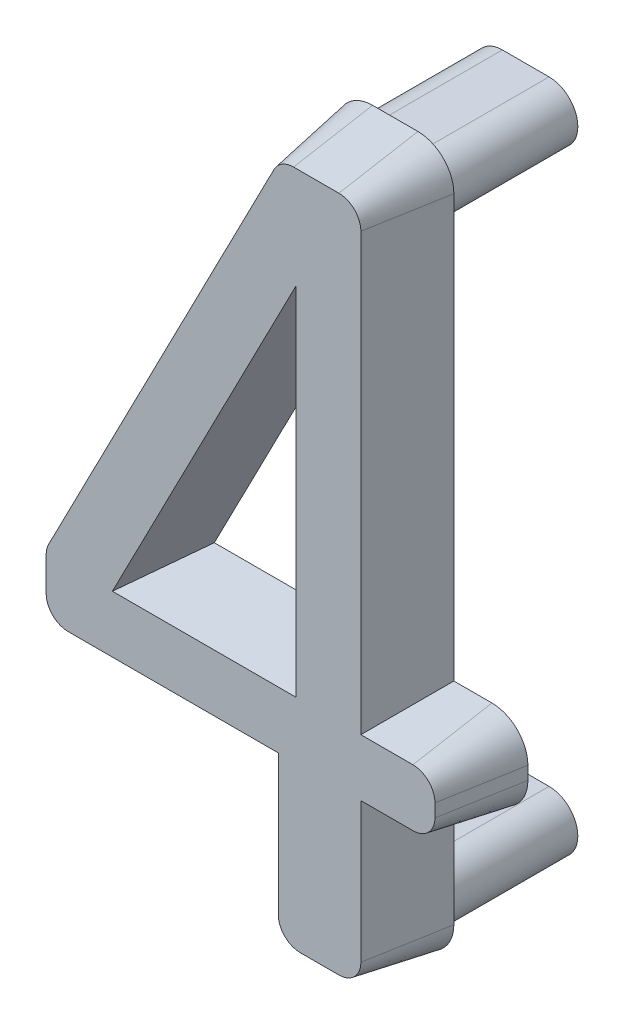
ISO-10303-21;
HEADER;
FILE_DESCRIPTION(('STEP AP214'),'2;1');
FILE_NAME('part.step','',(''),(''),'','','');
FILE_SCHEMA(('AUTOMOTIVE_DESIGN { 1 0 10303 214 1 1 1 1 }'));
ENDSEC;
DATA;
#1=APPLICATION_CONTEXT('core data for automotive mechanical design processes');
#2=APPLICATION_PROTOCOL_DEFINITION('international standard','automotive_design',2000,#1);
#3=PRODUCT_CONTEXT('',#1,'mechanical');
#4=PRODUCT('Part','Part','',(#3));
#5=PRODUCT_RELATED_PRODUCT_CATEGORY('part','',(#4));
#6=PRODUCT_DEFINITION_FORMATION('','',#4);
#7=PRODUCT_DEFINITION_CONTEXT('part definition',#1,'design');
#8=PRODUCT_DEFINITION('design','',#6,#7);
#9=PRODUCT_DEFINITION_SHAPE('','',#8);
#10=(LENGTH_UNIT() NAMED_UNIT(*) SI_UNIT(.MILLI.,.METRE.));
#11=(NAMED_UNIT(*) PLANE_ANGLE_UNIT() SI_UNIT($,.RADIAN.));
#12=(NAMED_UNIT(*) SI_UNIT($,.STERADIAN.) SOLID_ANGLE_UNIT());
#13=UNCERTAINTY_MEASURE_WITH_UNIT(LENGTH_MEASURE(1.E-05),#10,'distance_accuracy_value','');
#14=(GEOMETRIC_REPRESENTATION_CONTEXT(3) GLOBAL_UNCERTAINTY_ASSIGNED_CONTEXT((#13)) GLOBAL_UNIT_ASSIGNED_CONTEXT((#10,
#11,#12)) REPRESENTATION_CONTEXT('',''));
#15=CARTESIAN_POINT('',(0.,0.,0.));
#16=DIRECTION('',(0.,0.,1.));
#17=DIRECTION('',(1.,0.,0.));
#18=AXIS2_PLACEMENT_3D('',#15,#16,#17);
#19=CARTESIAN_POINT('',(60.3334080717489,1.17017937219731,2.2));
#20=DIRECTION('',(0.,0.,1.));
#21=DIRECTION('',(1.,0.,0.));
#22=AXIS2_PLACEMENT_3D('',#19,#20,#21);
#23=PLANE('',#22);
#24=CARTESIAN_POINT('',(60.3334080717489,1.17017937219731,2.2));
#25=DIRECTION('',(0.,0.,1.));
#26=DIRECTION('',(1.,0.,0.));
#27=AXIS2_PLACEMENT_3D('',#24,#25,#26);
#28=CIRCLE('',#27,0.612080642441377);
#29=CARTESIAN_POINT('',(59.7213274293075,1.17017937219731,2.2));
#30=VERTEX_POINT('',#29);
#31=CARTESIAN_POINT('',(60.3334080717489,0.558098729755932,2.2));
#32=VERTEX_POINT('',#31);
#33=EDGE_CURVE('E352',#30,#32,#28,.T.);
#34=ORIENTED_EDGE('',*,*,#33,.T.);
#35=DIRECTION('',(-1.,0.,0.));
#36=VECTOR('',#35,1.);
#37=CARTESIAN_POINT('',(61.407735426009,0.558098729755932,2.2));
#38=LINE('',#37,#36);
#39=CARTESIAN_POINT('',(61.407735426009,0.558098729755932,2.2));
#40=VERTEX_POINT('',#39);
#41=EDGE_CURVE('E410',#32,#40,#38,.F.);
#42=ORIENTED_EDGE('',*,*,#41,.T.);
#43=CARTESIAN_POINT('',(61.407735426009,1.17017937219731,2.2));
#44=DIRECTION('',(0.,0.,1.));
#45=DIRECTION('',(1.,0.,0.));
#46=AXIS2_PLACEMENT_3D('',#43,#44,#45);
#47=CIRCLE('',#46,0.612080642441377);
#48=CARTESIAN_POINT('',(62.0198160684504,1.17017937219732,2.2));
#49=VERTEX_POINT('',#48);
#50=EDGE_CURVE('E412',#40,#49,#47,.T.);
#51=ORIENTED_EDGE('',*,*,#50,.T.);
#52=DIRECTION('',(0.,-1.,0.));
#53=VECTOR('',#52,1.);
#54=CARTESIAN_POINT('',(62.0198160684504,4.67993273542601,2.2));
#55=LINE('',#54,#53);
#56=CARTESIAN_POINT('',(62.0198160684504,5.06785209298463,2.2));
#57=VERTEX_POINT('',#56);
#58=EDGE_CURVE('E414',#49,#57,#55,.F.);
#59=ORIENTED_EDGE('',*,*,#58,.T.);
#60=DIRECTION('',(-1.,0.,0.));
#61=VECTOR('',#60,1.);
#62=CARTESIAN_POINT('',(63.4683856502242,5.06785209298463,2.2));
#63=LINE('',#62,#61);
#64=CARTESIAN_POINT('',(63.4683856502242,5.06785209298463,2.2));
#65=VERTEX_POINT('',#64);
#66=EDGE_CURVE('E416',#57,#65,#63,.F.);
#67=ORIENTED_EDGE('',*,*,#66,.T.);
#68=CARTESIAN_POINT('',(63.4683856502242,5.67993273542601,2.2));
#69=DIRECTION('',(0.,0.,1.));
#70=DIRECTION('',(1.,0.,0.));
#71=AXIS2_PLACEMENT_3D('',#68,#69,#70);
#72=CIRCLE('',#71,0.612080642441377);
#73=CARTESIAN_POINT('',(64.0804662926656,5.67993273542602,2.2));
#74=VERTEX_POINT('',#73);
#75=EDGE_CURVE('E418',#65,#74,#72,.T.);
#76=ORIENTED_EDGE('',*,*,#75,.T.);
#77=DIRECTION('',(0.,-1.,0.));
#78=VECTOR('',#77,1.);
#79=CARTESIAN_POINT('',(64.0804662926656,6.0439461883408,2.2));
#80=LINE('',#79,#78);
#81=CARTESIAN_POINT('',(64.0804662926656,6.0439461883408,2.2));
#82=VERTEX_POINT('',#81);
#83=EDGE_CURVE('E420',#74,#82,#80,.F.);
#84=ORIENTED_EDGE('',*,*,#83,.T.);
#85=CARTESIAN_POINT('',(63.4683856502242,6.04394618834081,2.2));
#86=DIRECTION('',(0.,0.,1.));
#87=DIRECTION('',(1.,0.,0.));
#88=AXIS2_PLACEMENT_3D('',#85,#86,#87);
#89=CIRCLE('',#88,0.612080642441377);
#90=CARTESIAN_POINT('',(63.4683856502242,6.65602683078219,2.2));
#91=VERTEX_POINT('',#90);
#92=EDGE_CURVE('E422',#82,#91,#89,.T.);
#93=ORIENTED_EDGE('',*,*,#92,.T.);
#94=DIRECTION('',(1.,0.,0.));
#95=VECTOR('',#94,1.);
#96=CARTESIAN_POINT('',(62.407735426009,6.65602683078219,2.2));
#97=LINE('',#96,#95);
#98=CARTESIAN_POINT('',(62.0198160684504,6.65602683078219,2.2));
#99=VERTEX_POINT('',#98);
#100=EDGE_CURVE('E424',#91,#99,#97,.F.);
#101=ORIENTED_EDGE('',*,*,#100,.T.);
#102=DIRECTION('',(0.,-1.,0.));
#103=VECTOR('',#102,1.);
#104=CARTESIAN_POINT('',(62.0198160684504,18.7889013452915,2.2));
#105=LINE('',#104,#103);
#106=CARTESIAN_POINT('',(62.0198160684504,18.7889013452915,2.2));
#107=VERTEX_POINT('',#106);
#108=EDGE_CURVE('E426',#99,#107,#105,.F.);
#109=ORIENTED_EDGE('',*,*,#108,.T.);
#110=CARTESIAN_POINT('',(61.407735426009,18.7889013452915,2.2));
#111=DIRECTION('',(0.,0.,1.));
#112=DIRECTION('',(1.,0.,0.));
#113=AXIS2_PLACEMENT_3D('',#110,#111,#112);
#114=CIRCLE('',#113,0.612080642441378);
#115=CARTESIAN_POINT('',(61.407735426009,19.4009819877329,2.2));
#116=VERTEX_POINT('',#115);
#117=EDGE_CURVE('E428',#107,#116,#114,.T.);
#118=ORIENTED_EDGE('',*,*,#117,.T.);
#119=DIRECTION('',(1.,0.,0.));
#120=VECTOR('',#119,1.);
#121=CARTESIAN_POINT('',(60.1464589751106,19.4009819877329,2.2));
#122=LINE('',#121,#120);
#123=CARTESIAN_POINT('',(60.1464589751106,19.4009819877329,2.2));
#124=VERTEX_POINT('',#123);
#125=EDGE_CURVE('E430',#116,#124,#122,.F.);
#126=ORIENTED_EDGE('',*,*,#125,.T.);
#127=CARTESIAN_POINT('',(60.1464589751106,18.7889013452915,2.2));
#128=DIRECTION('',(0.,0.,1.));
#129=DIRECTION('',(1.,0.,0.));
#130=AXIS2_PLACEMENT_3D('',#127,#128,#129);
#131=CIRCLE('',#130,0.612080642441377);
#132=CARTESIAN_POINT('',(59.6024021071815,19.0693382139636,2.2));
#133=VERTEX_POINT('',#132);
#134=EDGE_CURVE('E432',#124,#133,#131,.T.);
#135=ORIENTED_EDGE('',*,*,#134,.T.);
#136=DIRECTION('',(0.458169805131459,0.888864685801951,0.));
#137=VECTOR('',#136,1.);
#138=CARTESIAN_POINT('',(53.329934163461,6.9005414369734,2.2));
#139=LINE('',#138,#137);
#140=CARTESIAN_POINT('',(53.329934163461,6.90054143697339,2.2));
#141=VERTEX_POINT('',#140);
#142=EDGE_CURVE('E434',#133,#141,#139,.F.);
#143=ORIENTED_EDGE('',*,*,#142,.T.);
#144=CARTESIAN_POINT('',(53.8739910313901,6.62010456830129,2.2));
#145=DIRECTION('',(0.,0.,1.));
#146=DIRECTION('',(1.,0.,0.));
#147=AXIS2_PLACEMENT_3D('',#144,#145,#146);
#148=CIRCLE('',#147,0.612080642441379);
#149=CARTESIAN_POINT('',(53.2619103889488,6.62010456830129,2.2));
#150=VERTEX_POINT('',#149);
#151=EDGE_CURVE('E436',#141,#150,#148,.T.);
#152=ORIENTED_EDGE('',*,*,#151,.T.);
#153=DIRECTION('',(0.,1.,0.));
#154=VECTOR('',#153,1.);
#155=CARTESIAN_POINT('',(53.2619103889488,5.67993273542602,2.2));
#156=LINE('',#155,#154);
#157=CARTESIAN_POINT('',(53.2619103889488,5.67993273542601,2.2));
#158=VERTEX_POINT('',#157);
#159=EDGE_CURVE('E438',#150,#158,#156,.F.);
#160=ORIENTED_EDGE('',*,*,#159,.T.);
#161=CARTESIAN_POINT('',(53.8739910313901,5.67993273542601,2.2));
#162=DIRECTION('',(0.,0.,1.));
#163=DIRECTION('',(1.,0.,0.));
#164=AXIS2_PLACEMENT_3D('',#161,#162,#163);
#165=CIRCLE('',#164,0.612080642441377);
#166=CARTESIAN_POINT('',(53.8739910313901,5.06785209298463,2.2));
#167=VERTEX_POINT('',#166);
#168=EDGE_CURVE('E440',#158,#167,#165,.T.);
#169=ORIENTED_EDGE('',*,*,#168,.T.);
#170=DIRECTION('',(-1.,0.,0.));
#171=VECTOR('',#170,1.);
#172=CARTESIAN_POINT('',(59.3334080717489,5.06785209298463,2.2));
#173=LINE('',#172,#171);
#174=CARTESIAN_POINT('',(59.7213274293075,5.06785209298463,2.2));
#175=VERTEX_POINT('',#174);
#176=EDGE_CURVE('E442',#167,#175,#173,.F.);
#177=ORIENTED_EDGE('',*,*,#176,.T.);
#178=DIRECTION('',(0.,1.,0.));
#179=VECTOR('',#178,1.);
#180=CARTESIAN_POINT('',(59.7213274293075,1.17017937219732,2.2));
#181=LINE('',#180,#179);
#182=EDGE_CURVE('E358',#175,#30,#181,.F.);
#183=ORIENTED_EDGE('',*,*,#182,.T.);
#184=EDGE_LOOP('',(#34,#42,#51,#59,#67,#76,#84,#93,#101,#109,#118,#126,#135,#143,#152,#160,#169,
#177,#183));
#185=FACE_BOUND('',#184,.T.);
#186=DIRECTION('',(0.,1.,0.));
#187=VECTOR('',#186,1.);
#188=CARTESIAN_POINT('',(60.2113791990813,7.04394618834081,2.2));
#189=LINE('',#188,#187);
#190=CARTESIAN_POINT('',(60.2113791990813,6.65602683078219,2.2));
#191=VERTEX_POINT('',#190);
#192=CARTESIAN_POINT('',(60.2113791990813,16.5630239643737,2.2));
#193=VERTEX_POINT('',#192);
#194=EDGE_CURVE('E37',#191,#193,#189,.T.);
#195=ORIENTED_EDGE('',*,*,#194,.F.);
#196=DIRECTION('',(1.,0.,0.));
#197=VECTOR('',#196,1.);
#198=CARTESIAN_POINT('',(55.7411434977579,6.65602683078219,2.2));
#199=LINE('',#198,#197);
#200=CARTESIAN_POINT('',(55.1047673394367,6.65602683078219,2.2));
#201=VERTEX_POINT('',#200);
#202=EDGE_CURVE('E311',#201,#191,#199,.T.);
#203=ORIENTED_EDGE('',*,*,#202,.F.);
#204=DIRECTION('',(-0.458169805131458,-0.888864685801951,0.));
#205=VECTOR('',#204,1.);
#206=CARTESIAN_POINT('',(59.4786520236499,15.1415088333589,2.2));
#207=LINE('',#206,#205);
#208=EDGE_CURVE('E449',#193,#201,#207,.T.);
#209=ORIENTED_EDGE('',*,*,#208,.F.);
#210=EDGE_LOOP('',(#195,#203,#209));
#211=FACE_BOUND('',#210,.T.);
#212=ADVANCED_FACE('F33',(#185,#211),#23,.T.);
#213=CARTESIAN_POINT('',(60.3334080717489,1.17017937219731,0.));
#214=DIRECTION('',(0.,0.,1.));
#215=DIRECTION('',(1.,0.,0.));
#216=AXIS2_PLACEMENT_3D('',#213,#214,#215);
#217=PLANE('',#216);
#218=DIRECTION('',(-1.,0.,0.));
#219=VECTOR('',#218,1.);
#220=CARTESIAN_POINT('',(60.157735426009,2.22954035874512,0.));
#221=LINE('',#220,#219);
#222=CARTESIAN_POINT('',(61.457735426009,2.22954035874512,0.));
#223=VERTEX_POINT('',#222);
#224=CARTESIAN_POINT('',(60.157735426009,2.22954035874512,0.));
#225=VERTEX_POINT('',#224);
#226=EDGE_CURVE('E257',#223,#225,#221,.T.);
#227=ORIENTED_EDGE('',*,*,#226,.T.);
#228=CARTESIAN_POINT('',(60.157735426009,1.42954035874476,0.));
#229=DIRECTION('',(0.,0.,1.));
#230=DIRECTION('',(1.,0.,0.));
#231=AXIS2_PLACEMENT_3D('',#228,#229,#230);
#232=CIRCLE('',#231,0.800000000000365);
#233=CARTESIAN_POINT('',(60.157735426009,0.629540358744395,0.));
#234=VERTEX_POINT('',#233);
#235=EDGE_CURVE('E264',#225,#234,#232,.T.);
#236=ORIENTED_EDGE('',*,*,#235,.T.);
#237=DIRECTION('',(1.,0.,0.));
#238=VECTOR('',#237,1.);
#239=CARTESIAN_POINT('',(60.157735426009,0.629540358744395,0.));
#240=LINE('',#239,#238);
#241=CARTESIAN_POINT('',(61.457735426009,0.629540358744395,0.));
#242=VERTEX_POINT('',#241);
#243=EDGE_CURVE('E237',#234,#242,#240,.T.);
#244=ORIENTED_EDGE('',*,*,#243,.T.);
#245=CARTESIAN_POINT('',(61.457735426009,1.42954035874476,0.));
#246=DIRECTION('',(0.,0.,1.));
#247=DIRECTION('',(1.,0.,0.));
#248=AXIS2_PLACEMENT_3D('',#245,#246,#247);
#249=CIRCLE('',#248,0.800000000000365);
#250=EDGE_CURVE('E50',#242,#223,#249,.T.);
#251=ORIENTED_EDGE('',*,*,#250,.T.);
#252=EDGE_LOOP('',(#227,#236,#244,#251));
#253=FACE_BOUND('',#252,.T.);
#254=DIRECTION('',(-1.,0.,0.));
#255=VECTOR('',#254,1.);
#256=CARTESIAN_POINT('',(60.157735426009,19.3295403587448,0.));
#257=LINE('',#256,#255);
#258=CARTESIAN_POINT('',(61.457735426009,19.3295403587448,0.));
#259=VERTEX_POINT('',#258);
#260=CARTESIAN_POINT('',(60.157735426009,19.3295403587448,0.));
#261=VERTEX_POINT('',#260);
#262=EDGE_CURVE('E277',#259,#261,#257,.T.);
#263=ORIENTED_EDGE('',*,*,#262,.T.);
#264=CARTESIAN_POINT('',(60.157735426009,18.5295403587448,0.));
#265=DIRECTION('',(0.,0.,1.));
#266=DIRECTION('',(1.,0.,0.));
#267=AXIS2_PLACEMENT_3D('',#264,#265,#266);
#268=CIRCLE('',#267,0.800000000000002);
#269=CARTESIAN_POINT('',(60.157735426009,17.7295403587448,0.));
#270=VERTEX_POINT('',#269);
#271=EDGE_CURVE('E269',#261,#270,#268,.T.);
#272=ORIENTED_EDGE('',*,*,#271,.T.);
#273=DIRECTION('',(1.,0.,0.));
#274=VECTOR('',#273,1.);
#275=CARTESIAN_POINT('',(60.157735426009,17.7295403587448,0.));
#276=LINE('',#275,#274);
#277=CARTESIAN_POINT('',(61.457735426009,17.7295403587448,0.));
#278=VERTEX_POINT('',#277);
#279=EDGE_CURVE('E289',#270,#278,#276,.T.);
#280=ORIENTED_EDGE('',*,*,#279,.T.);
#281=CARTESIAN_POINT('',(61.457735426009,18.5295403587448,0.));
#282=DIRECTION('',(0.,0.,1.));
#283=DIRECTION('',(1.,0.,0.));
#284=AXIS2_PLACEMENT_3D('',#281,#282,#283);
#285=CIRCLE('',#284,0.800000000000002);
#286=EDGE_CURVE('E58',#278,#259,#285,.T.);
#287=ORIENTED_EDGE('',*,*,#286,.T.);
#288=EDGE_LOOP('',(#263,#272,#280,#287));
#289=FACE_BOUND('',#288,.T.);
#290=CARTESIAN_POINT('',(60.3334080717489,1.17017937219731,0.));
#291=DIRECTION('',(0.,0.,1.));
#292=DIRECTION('',(1.,0.,0.));
#293=AXIS2_PLACEMENT_3D('',#290,#291,#292);
#294=CIRCLE('',#293,1.);
#295=CARTESIAN_POINT('',(59.3334080717489,1.17017937219732,0.));
#296=VERTEX_POINT('',#295);
#297=CARTESIAN_POINT('',(60.3334080717489,0.170179372197309,0.));
#298=VERTEX_POINT('',#297);
#299=EDGE_CURVE('E312',#296,#298,#294,.T.);
#300=ORIENTED_EDGE('',*,*,#299,.F.);
#301=DIRECTION('',(0.,-1.,0.));
#302=VECTOR('',#301,1.);
#303=CARTESIAN_POINT('',(59.3334080717489,1.17017937219732,0.));
#304=LINE('',#303,#302);
#305=CARTESIAN_POINT('',(59.3334080717489,4.67993273542601,0.));
#306=VERTEX_POINT('',#305);
#307=EDGE_CURVE('E351',#306,#296,#304,.T.);
#308=ORIENTED_EDGE('',*,*,#307,.F.);
#309=DIRECTION('',(1.,0.,0.));
#310=VECTOR('',#309,1.);
#311=CARTESIAN_POINT('',(59.3334080717489,4.67993273542601,0.));
#312=LINE('',#311,#310);
#313=CARTESIAN_POINT('',(53.8739910313901,4.67993273542601,0.));
#314=VERTEX_POINT('',#313);
#315=EDGE_CURVE('E348',#314,#306,#312,.T.);
#316=ORIENTED_EDGE('',*,*,#315,.F.);
#317=CARTESIAN_POINT('',(53.8739910313901,5.67993273542601,0.));
#318=DIRECTION('',(0.,0.,1.));
#319=DIRECTION('',(-1.,0.,0.));
#320=AXIS2_PLACEMENT_3D('',#317,#318,#319);
#321=CIRCLE('',#320,1.);
#322=CARTESIAN_POINT('',(52.8739910313901,5.67993273542601,0.));
#323=VERTEX_POINT('',#322);
#324=EDGE_CURVE('E346',#323,#314,#321,.T.);
#325=ORIENTED_EDGE('',*,*,#324,.F.);
#326=DIRECTION('',(0.,-1.,0.));
#327=VECTOR('',#326,1.);
#328=CARTESIAN_POINT('',(52.8739910313901,5.67993273542602,0.));
#329=LINE('',#328,#327);
#330=CARTESIAN_POINT('',(52.8739910313901,6.62010456830129,0.));
#331=VERTEX_POINT('',#330);
#332=EDGE_CURVE('E344',#331,#323,#329,.T.);
#333=ORIENTED_EDGE('',*,*,#332,.F.);
#334=CARTESIAN_POINT('',(53.8739910313901,6.62010456830129,0.));
#335=DIRECTION('',(0.,0.,1.));
#336=DIRECTION('',(-1.,0.,0.));
#337=AXIS2_PLACEMENT_3D('',#334,#335,#336);
#338=CIRCLE('',#337,1.);
#339=CARTESIAN_POINT('',(52.9851263455882,7.07827437343275,0.));
#340=VERTEX_POINT('',#339);
#341=EDGE_CURVE('E342',#340,#331,#338,.T.);
#342=ORIENTED_EDGE('',*,*,#341,.F.);
#343=DIRECTION('',(-0.458169805131459,-0.888864685801951,0.));
#344=VECTOR('',#343,1.);
#345=CARTESIAN_POINT('',(52.9851263455882,7.07827437343275,0.));
#346=LINE('',#345,#344);
#347=CARTESIAN_POINT('',(59.2575942893087,19.2470711504229,0.));
#348=VERTEX_POINT('',#347);
#349=EDGE_CURVE('E340',#348,#340,#346,.T.);
#350=ORIENTED_EDGE('',*,*,#349,.F.);
#351=CARTESIAN_POINT('',(60.1464589751106,18.7889013452915,0.));
#352=DIRECTION('',(0.,0.,1.));
#353=DIRECTION('',(-1.,0.,0.));
#354=AXIS2_PLACEMENT_3D('',#351,#352,#353);
#355=CIRCLE('',#354,1.);
#356=CARTESIAN_POINT('',(60.1464589751106,19.7889013452915,0.));
#357=VERTEX_POINT('',#356);
#358=EDGE_CURVE('E338',#357,#348,#355,.T.);
#359=ORIENTED_EDGE('',*,*,#358,.F.);
#360=DIRECTION('',(-1.,0.,0.));
#361=VECTOR('',#360,1.);
#362=CARTESIAN_POINT('',(60.1464589751106,19.7889013452915,0.));
#363=LINE('',#362,#361);
#364=CARTESIAN_POINT('',(61.407735426009,19.7889013452915,0.));
#365=VERTEX_POINT('',#364);
#366=EDGE_CURVE('E336',#365,#357,#363,.T.);
#367=ORIENTED_EDGE('',*,*,#366,.F.);
#368=CARTESIAN_POINT('',(61.407735426009,18.7889013452915,0.));
#369=DIRECTION('',(0.,0.,1.));
#370=DIRECTION('',(-1.,0.,0.));
#371=AXIS2_PLACEMENT_3D('',#368,#369,#370);
#372=CIRCLE('',#371,1.);
#373=CARTESIAN_POINT('',(62.407735426009,18.7889013452915,0.));
#374=VERTEX_POINT('',#373);
#375=EDGE_CURVE('E334',#374,#365,#372,.T.);
#376=ORIENTED_EDGE('',*,*,#375,.F.);
#377=DIRECTION('',(0.,1.,0.));
#378=VECTOR('',#377,1.);
#379=CARTESIAN_POINT('',(62.407735426009,18.7889013452915,0.));
#380=LINE('',#379,#378);
#381=CARTESIAN_POINT('',(62.407735426009,7.04394618834081,0.));
#382=VERTEX_POINT('',#381);
#383=EDGE_CURVE('E332',#382,#374,#380,.T.);
#384=ORIENTED_EDGE('',*,*,#383,.F.);
#385=DIRECTION('',(-1.,0.,0.));
#386=VECTOR('',#385,1.);
#387=CARTESIAN_POINT('',(62.407735426009,7.04394618834081,0.));
#388=LINE('',#387,#386);
#389=CARTESIAN_POINT('',(63.4683856502242,7.04394618834081,0.));
#390=VERTEX_POINT('',#389);
#391=EDGE_CURVE('E330',#390,#382,#388,.T.);
#392=ORIENTED_EDGE('',*,*,#391,.F.);
#393=CARTESIAN_POINT('',(63.4683856502242,6.04394618834081,0.));
#394=DIRECTION('',(0.,0.,1.));
#395=DIRECTION('',(-1.,0.,0.));
#396=AXIS2_PLACEMENT_3D('',#393,#394,#395);
#397=CIRCLE('',#396,1.);
#398=CARTESIAN_POINT('',(64.4683856502242,6.0439461883408,0.));
#399=VERTEX_POINT('',#398);
#400=EDGE_CURVE('E328',#399,#390,#397,.T.);
#401=ORIENTED_EDGE('',*,*,#400,.F.);
#402=DIRECTION('',(0.,1.,0.));
#403=VECTOR('',#402,1.);
#404=CARTESIAN_POINT('',(64.4683856502242,6.0439461883408,0.));
#405=LINE('',#404,#403);
#406=CARTESIAN_POINT('',(64.4683856502242,5.67993273542602,0.));
#407=VERTEX_POINT('',#406);
#408=EDGE_CURVE('E326',#407,#399,#405,.T.);
#409=ORIENTED_EDGE('',*,*,#408,.F.);
#410=CARTESIAN_POINT('',(63.4683856502242,5.67993273542601,0.));
#411=DIRECTION('',(0.,0.,1.));
#412=DIRECTION('',(-1.,0.,0.));
#413=AXIS2_PLACEMENT_3D('',#410,#411,#412);
#414=CIRCLE('',#413,1.);
#415=CARTESIAN_POINT('',(63.4683856502242,4.67993273542601,0.));
#416=VERTEX_POINT('',#415);
#417=EDGE_CURVE('E324',#416,#407,#414,.T.);
#418=ORIENTED_EDGE('',*,*,#417,.F.);
#419=DIRECTION('',(1.,0.,0.));
#420=VECTOR('',#419,1.);
#421=CARTESIAN_POINT('',(63.4683856502242,4.67993273542601,0.));
#422=LINE('',#421,#420);
#423=CARTESIAN_POINT('',(62.407735426009,4.67993273542601,0.));
#424=VERTEX_POINT('',#423);
#425=EDGE_CURVE('E322',#424,#416,#422,.T.);
#426=ORIENTED_EDGE('',*,*,#425,.F.);
#427=DIRECTION('',(0.,1.,0.));
#428=VECTOR('',#427,1.);
#429=CARTESIAN_POINT('',(62.407735426009,4.67993273542601,0.));
#430=LINE('',#429,#428);
#431=CARTESIAN_POINT('',(62.407735426009,1.17017937219732,0.));
#432=VERTEX_POINT('',#431);
#433=EDGE_CURVE('E320',#432,#424,#430,.T.);
#434=ORIENTED_EDGE('',*,*,#433,.F.);
#435=CARTESIAN_POINT('',(61.407735426009,1.17017937219731,0.));
#436=DIRECTION('',(0.,0.,1.));
#437=DIRECTION('',(-1.,0.,0.));
#438=AXIS2_PLACEMENT_3D('',#435,#436,#437);
#439=CIRCLE('',#438,1.);
#440=CARTESIAN_POINT('',(61.407735426009,0.170179372197309,0.));
#441=VERTEX_POINT('',#440);
#442=EDGE_CURVE('E318',#441,#432,#439,.T.);
#443=ORIENTED_EDGE('',*,*,#442,.F.);
#444=DIRECTION('',(1.,0.,0.));
#445=VECTOR('',#444,1.);
#446=CARTESIAN_POINT('',(61.407735426009,0.170179372197309,0.));
#447=LINE('',#446,#445);
#448=EDGE_CURVE('E315',#298,#441,#447,.T.);
#449=ORIENTED_EDGE('',*,*,#448,.F.);
#450=EDGE_LOOP('',(#300,#308,#316,#325,#333,#342,#350,#359,#367,#376,#384,#392,#401,#409,#418,
#426,#434,#443,#449));
#451=FACE_BOUND('',#450,.T.);
#452=DIRECTION('',(1.,0.,0.));
#453=VECTOR('',#452,1.);
#454=CARTESIAN_POINT('',(55.7411434977579,7.04394618834081,0.));
#455=LINE('',#454,#453);
#456=CARTESIAN_POINT('',(55.7411434977579,7.04394618834081,0.));
#457=VERTEX_POINT('',#456);
#458=CARTESIAN_POINT('',(59.8234598415227,7.04394618834081,0.));
#459=VERTEX_POINT('',#458);
#460=EDGE_CURVE('E297',#457,#459,#455,.T.);
#461=ORIENTED_EDGE('',*,*,#460,.T.);
#462=DIRECTION('',(0.,1.,0.));
#463=VECTOR('',#462,1.);
#464=CARTESIAN_POINT('',(59.8234598415227,7.04394618834081,0.));
#465=LINE('',#464,#463);
#466=CARTESIAN_POINT('',(59.8234598415227,14.9637758968996,0.));
#467=VERTEX_POINT('',#466);
#468=EDGE_CURVE('E305',#459,#467,#465,.T.);
#469=ORIENTED_EDGE('',*,*,#468,.T.);
#470=DIRECTION('',(-0.458169805131458,-0.888864685801951,0.));
#471=VECTOR('',#470,1.);
#472=CARTESIAN_POINT('',(59.8234598415227,14.9637758968996,0.));
#473=LINE('',#472,#471);
#474=EDGE_CURVE('E308',#467,#457,#473,.T.);
#475=ORIENTED_EDGE('',*,*,#474,.T.);
#476=EDGE_LOOP('',(#461,#469,#475));
#477=FACE_BOUND('',#476,.T.);
#478=ADVANCED_FACE('F467',(#253,#289,#451,#477),#217,.F.);
#479=CARTESIAN_POINT('',(60.3334080717489,1.17017937219731,0.));
#480=DIRECTION('',(0.,0.,-1.));
#481=DIRECTION('',(1.,0.,0.));
#482=AXIS2_PLACEMENT_3D('',#479,#480,#481);
#483=CONICAL_SURFACE('',#482,1.,0.174532925199433);
#484=ORIENTED_EDGE('',*,*,#299,.T.);
#485=DIRECTION('',(0.,-0.17364817766693,-0.984807753012208));
#486=VECTOR('',#485,1.);
#487=CARTESIAN_POINT('',(60.3334080717489,0.170179372197309,0.));
#488=LINE('',#487,#486);
#489=EDGE_CURVE('E11',#32,#298,#488,.T.);
#490=ORIENTED_EDGE('',*,*,#489,.F.);
#491=ORIENTED_EDGE('',*,*,#33,.F.);
#492=DIRECTION('',(-0.17364817766693,0.,-0.984807753012208));
#493=VECTOR('',#492,1.);
#494=CARTESIAN_POINT('',(59.3334080717489,1.17017937219732,0.));
#495=LINE('',#494,#493);
#496=EDGE_CURVE('E354',#30,#296,#495,.T.);
#497=ORIENTED_EDGE('',*,*,#496,.T.);
#498=EDGE_LOOP('',(#484,#490,#491,#497));
#499=FACE_BOUND('',#498,.T.);
#500=ADVANCED_FACE('F469',(#499),#483,.T.);
#501=CARTESIAN_POINT('',(61.407735426009,0.170179372197309,0.));
#502=DIRECTION('',(0.,-0.984807753012208,0.17364817766693));
#503=DIRECTION('',(0.,-0.17364817766693,-0.984807753012208));
#504=AXIS2_PLACEMENT_3D('',#501,#502,#503);
#505=PLANE('',#504);
#506=ORIENTED_EDGE('',*,*,#448,.T.);
#507=DIRECTION('',(0.,-0.17364817766693,-0.984807753012208));
#508=VECTOR('',#507,1.);
#509=CARTESIAN_POINT('',(61.407735426009,0.170179372197309,0.));
#510=LINE('',#509,#508);
#511=EDGE_CURVE('E42',#40,#441,#510,.T.);
#512=ORIENTED_EDGE('',*,*,#511,.F.);
#513=ORIENTED_EDGE('',*,*,#41,.F.);
#514=ORIENTED_EDGE('',*,*,#489,.T.);
#515=EDGE_LOOP('',(#506,#512,#513,#514));
#516=FACE_BOUND('',#515,.T.);
#517=ADVANCED_FACE('F476',(#516),#505,.T.);
#518=CARTESIAN_POINT('',(61.407735426009,1.17017937219731,0.));
#519=DIRECTION('',(0.,0.,-1.));
#520=DIRECTION('',(-1.,0.,0.));
#521=AXIS2_PLACEMENT_3D('',#518,#519,#520);
#522=CONICAL_SURFACE('',#521,1.,0.174532925199433);
#523=ORIENTED_EDGE('',*,*,#442,.T.);
#524=DIRECTION('',(0.17364817766693,0.,-0.984807753012208));
#525=VECTOR('',#524,1.);
#526=CARTESIAN_POINT('',(62.407735426009,1.17017937219732,0.));
#527=LINE('',#526,#525);
#528=EDGE_CURVE('E403',#49,#432,#527,.T.);
#529=ORIENTED_EDGE('',*,*,#528,.F.);
#530=ORIENTED_EDGE('',*,*,#50,.F.);
#531=ORIENTED_EDGE('',*,*,#511,.T.);
#532=EDGE_LOOP('',(#523,#529,#530,#531));
#533=FACE_BOUND('',#532,.T.);
#534=ADVANCED_FACE('F547',(#533),#522,.T.);
#535=CARTESIAN_POINT('',(62.407735426009,4.67993273542601,0.));
#536=DIRECTION('',(0.984807753012208,0.,0.17364817766693));
#537=DIRECTION('',(0.17364817766693,0.,-0.984807753012208));
#538=AXIS2_PLACEMENT_3D('',#535,#536,#537);
#539=PLANE('',#538);
#540=ORIENTED_EDGE('',*,*,#433,.T.);
#541=DIRECTION('',(0.171087869746036,-0.171087869746036,-0.970287525247814));
#542=VECTOR('',#541,1.);
#543=CARTESIAN_POINT('',(62.407735426009,4.67993273542601,0.));
#544=LINE('',#543,#542);
#545=EDGE_CURVE('E400',#57,#424,#544,.T.);
#546=ORIENTED_EDGE('',*,*,#545,.F.);
#547=ORIENTED_EDGE('',*,*,#58,.F.);
#548=ORIENTED_EDGE('',*,*,#528,.T.);
#549=EDGE_LOOP('',(#540,#546,#547,#548));
#550=FACE_BOUND('',#549,.T.);
#551=ADVANCED_FACE('F543',(#550),#539,.T.);
#552=CARTESIAN_POINT('',(63.4683856502242,4.67993273542601,0.));
#553=DIRECTION('',(0.,-0.984807753012208,0.17364817766693));
#554=DIRECTION('',(0.,-0.17364817766693,-0.984807753012208));
#555=AXIS2_PLACEMENT_3D('',#552,#553,#554);
#556=PLANE('',#555);
#557=ORIENTED_EDGE('',*,*,#425,.T.);
#558=DIRECTION('',(0.,-0.17364817766693,-0.984807753012208));
#559=VECTOR('',#558,1.);
#560=CARTESIAN_POINT('',(63.4683856502242,4.67993273542601,0.));
#561=LINE('',#560,#559);
#562=EDGE_CURVE('E397',#65,#416,#561,.T.);
#563=ORIENTED_EDGE('',*,*,#562,.F.);
#564=ORIENTED_EDGE('',*,*,#66,.F.);
#565=ORIENTED_EDGE('',*,*,#545,.T.);
#566=EDGE_LOOP('',(#557,#563,#564,#565));
#567=FACE_BOUND('',#566,.T.);
#568=ADVANCED_FACE('F539',(#567),#556,.T.);
#569=CARTESIAN_POINT('',(63.4683856502242,5.67993273542601,0.));
#570=DIRECTION('',(0.,0.,-1.));
#571=DIRECTION('',(-1.,0.,0.));
#572=AXIS2_PLACEMENT_3D('',#569,#570,#571);
#573=CONICAL_SURFACE('',#572,1.,0.174532925199433);
#574=ORIENTED_EDGE('',*,*,#417,.T.);
#575=DIRECTION('',(0.17364817766693,0.,-0.984807753012208));
#576=VECTOR('',#575,1.);
#577=CARTESIAN_POINT('',(64.4683856502242,5.67993273542602,0.));
#578=LINE('',#577,#576);
#579=EDGE_CURVE('E394',#74,#407,#578,.T.);
#580=ORIENTED_EDGE('',*,*,#579,.F.);
#581=ORIENTED_EDGE('',*,*,#75,.F.);
#582=ORIENTED_EDGE('',*,*,#562,.T.);
#583=EDGE_LOOP('',(#574,#580,#581,#582));
#584=FACE_BOUND('',#583,.T.);
#585=ADVANCED_FACE('F535',(#584),#573,.T.);
#586=CARTESIAN_POINT('',(64.4683856502242,6.0439461883408,0.));
#587=DIRECTION('',(0.984807753012208,0.,0.17364817766693));
#588=DIRECTION('',(0.17364817766693,0.,-0.984807753012208));
#589=AXIS2_PLACEMENT_3D('',#586,#587,#588);
#590=PLANE('',#589);
#591=ORIENTED_EDGE('',*,*,#408,.T.);
#592=DIRECTION('',(0.17364817766693,0.,-0.984807753012208));
#593=VECTOR('',#592,1.);
#594=CARTESIAN_POINT('',(64.4683856502242,6.0439461883408,0.));
#595=LINE('',#594,#593);
#596=EDGE_CURVE('E391',#82,#399,#595,.T.);
#597=ORIENTED_EDGE('',*,*,#596,.F.);
#598=ORIENTED_EDGE('',*,*,#83,.F.);
#599=ORIENTED_EDGE('',*,*,#579,.T.);
#600=EDGE_LOOP('',(#591,#597,#598,#599));
#601=FACE_BOUND('',#600,.T.);
#602=ADVANCED_FACE('F531',(#601),#590,.T.);
#603=CARTESIAN_POINT('',(63.4683856502242,6.04394618834081,0.));
#604=DIRECTION('',(0.,0.,-1.));
#605=DIRECTION('',(-1.,0.,0.));
#606=AXIS2_PLACEMENT_3D('',#603,#604,#605);
#607=CONICAL_SURFACE('',#606,1.,0.174532925199433);
#608=ORIENTED_EDGE('',*,*,#400,.T.);
#609=DIRECTION('',(0.,0.17364817766693,-0.984807753012208));
#610=VECTOR('',#609,1.);
#611=CARTESIAN_POINT('',(63.4683856502242,7.04394618834081,0.));
#612=LINE('',#611,#610);
#613=EDGE_CURVE('E388',#91,#390,#612,.T.);
#614=ORIENTED_EDGE('',*,*,#613,.F.);
#615=ORIENTED_EDGE('',*,*,#92,.F.);
#616=ORIENTED_EDGE('',*,*,#596,.T.);
#617=EDGE_LOOP('',(#608,#614,#615,#616));
#618=FACE_BOUND('',#617,.T.);
#619=ADVANCED_FACE('F527',(#618),#607,.T.);
#620=CARTESIAN_POINT('',(62.407735426009,7.04394618834081,0.));
#621=DIRECTION('',(0.,0.984807753012208,0.17364817766693));
#622=DIRECTION('',(0.,-0.17364817766693,0.984807753012208));
#623=AXIS2_PLACEMENT_3D('',#620,#621,#622);
#624=PLANE('',#623);
#625=ORIENTED_EDGE('',*,*,#391,.T.);
#626=DIRECTION('',(0.171087869746036,0.171087869746036,-0.970287525247814));
#627=VECTOR('',#626,1.);
#628=CARTESIAN_POINT('',(62.407735426009,7.04394618834081,0.));
#629=LINE('',#628,#627);
#630=EDGE_CURVE('E385',#99,#382,#629,.T.);
#631=ORIENTED_EDGE('',*,*,#630,.F.);
#632=ORIENTED_EDGE('',*,*,#100,.F.);
#633=ORIENTED_EDGE('',*,*,#613,.T.);
#634=EDGE_LOOP('',(#625,#631,#632,#633));
#635=FACE_BOUND('',#634,.T.);
#636=ADVANCED_FACE('F523',(#635),#624,.T.);
#637=CARTESIAN_POINT('',(62.407735426009,18.7889013452915,0.));
#638=DIRECTION('',(0.984807753012208,0.,0.17364817766693));
#639=DIRECTION('',(0.17364817766693,0.,-0.984807753012208));
#640=AXIS2_PLACEMENT_3D('',#637,#638,#639);
#641=PLANE('',#640);
#642=ORIENTED_EDGE('',*,*,#383,.T.);
#643=DIRECTION('',(0.17364817766693,0.,-0.984807753012208));
#644=VECTOR('',#643,1.);
#645=CARTESIAN_POINT('',(62.407735426009,18.7889013452915,0.));
#646=LINE('',#645,#644);
#647=EDGE_CURVE('E382',#107,#374,#646,.T.);
#648=ORIENTED_EDGE('',*,*,#647,.F.);
#649=ORIENTED_EDGE('',*,*,#108,.F.);
#650=ORIENTED_EDGE('',*,*,#630,.T.);
#651=EDGE_LOOP('',(#642,#648,#649,#650));
#652=FACE_BOUND('',#651,.T.);
#653=ADVANCED_FACE('F519',(#652),#641,.T.);
#654=CARTESIAN_POINT('',(61.407735426009,18.7889013452915,0.));
#655=DIRECTION('',(0.,0.,-1.));
#656=DIRECTION('',(-1.,0.,0.));
#657=AXIS2_PLACEMENT_3D('',#654,#655,#656);
#658=CONICAL_SURFACE('',#657,1.,0.174532925199433);
#659=ORIENTED_EDGE('',*,*,#375,.T.);
#660=DIRECTION('',(0.,0.17364817766693,-0.984807753012208));
#661=VECTOR('',#660,1.);
#662=CARTESIAN_POINT('',(61.407735426009,19.7889013452915,0.));
#663=LINE('',#662,#661);
#664=EDGE_CURVE('E379',#116,#365,#663,.T.);
#665=ORIENTED_EDGE('',*,*,#664,.F.);
#666=ORIENTED_EDGE('',*,*,#117,.F.);
#667=ORIENTED_EDGE('',*,*,#647,.T.);
#668=EDGE_LOOP('',(#659,#665,#666,#667));
#669=FACE_BOUND('',#668,.T.);
#670=ADVANCED_FACE('F515',(#669),#658,.T.);
#671=CARTESIAN_POINT('',(60.1464589751106,19.7889013452915,0.));
#672=DIRECTION('',(0.,0.984807753012208,0.17364817766693));
#673=DIRECTION('',(0.,-0.17364817766693,0.984807753012208));
#674=AXIS2_PLACEMENT_3D('',#671,#672,#673);
#675=PLANE('',#674);
#676=ORIENTED_EDGE('',*,*,#366,.T.);
#677=DIRECTION('',(0.,0.17364817766693,-0.984807753012208));
#678=VECTOR('',#677,1.);
#679=CARTESIAN_POINT('',(60.1464589751106,19.7889013452915,0.));
#680=LINE('',#679,#678);
#681=EDGE_CURVE('E376',#124,#357,#680,.T.);
#682=ORIENTED_EDGE('',*,*,#681,.F.);
#683=ORIENTED_EDGE('',*,*,#125,.F.);
#684=ORIENTED_EDGE('',*,*,#664,.T.);
#685=EDGE_LOOP('',(#676,#682,#683,#684));
#686=FACE_BOUND('',#685,.T.);
#687=ADVANCED_FACE('F511',(#686),#675,.T.);
#688=CARTESIAN_POINT('',(60.1464589751106,18.7889013452915,0.));
#689=DIRECTION('',(0.,0.,-1.));
#690=DIRECTION('',(-1.,0.,0.));
#691=AXIS2_PLACEMENT_3D('',#688,#689,#690);
#692=CONICAL_SURFACE('',#691,1.,0.174532925199433);
#693=ORIENTED_EDGE('',*,*,#358,.T.);
#694=DIRECTION('',(-0.154349732881997,0.0795603517230904,-0.984807753012208));
#695=VECTOR('',#694,1.);
#696=CARTESIAN_POINT('',(59.2575942893087,19.2470711504229,0.));
#697=LINE('',#696,#695);
#698=EDGE_CURVE('E373',#133,#348,#697,.T.);
#699=ORIENTED_EDGE('',*,*,#698,.F.);
#700=ORIENTED_EDGE('',*,*,#134,.F.);
#701=ORIENTED_EDGE('',*,*,#681,.T.);
#702=EDGE_LOOP('',(#693,#699,#700,#701));
#703=FACE_BOUND('',#702,.T.);
#704=ADVANCED_FACE('F507',(#703),#692,.T.);
#705=CARTESIAN_POINT('',(52.9851263455882,7.07827437343275,0.));
#706=DIRECTION('',(-0.875360833956522,0.451209176289553,0.17364817766693));
#707=DIRECTION('',(-0.458169805131459,-0.888864685801951,0.));
#708=AXIS2_PLACEMENT_3D('',#705,#706,#707);
#709=PLANE('',#708);
#710=ORIENTED_EDGE('',*,*,#349,.T.);
#711=DIRECTION('',(-0.154349732881997,0.0795603517230905,-0.984807753012208));
#712=VECTOR('',#711,1.);
#713=CARTESIAN_POINT('',(52.9851263455882,7.07827437343275,0.));
#714=LINE('',#713,#712);
#715=EDGE_CURVE('E370',#141,#340,#714,.T.);
#716=ORIENTED_EDGE('',*,*,#715,.F.);
#717=ORIENTED_EDGE('',*,*,#142,.F.);
#718=ORIENTED_EDGE('',*,*,#698,.T.);
#719=EDGE_LOOP('',(#710,#716,#717,#718));
#720=FACE_BOUND('',#719,.T.);
#721=ADVANCED_FACE('F503',(#720),#709,.T.);
#722=CARTESIAN_POINT('',(53.8739910313901,6.62010456830129,0.));
#723=DIRECTION('',(0.,0.,-1.));
#724=DIRECTION('',(-1.,0.,0.));
#725=AXIS2_PLACEMENT_3D('',#722,#723,#724);
#726=CONICAL_SURFACE('',#725,1.,0.174532925199433);
#727=ORIENTED_EDGE('',*,*,#341,.T.);
#728=DIRECTION('',(-0.17364817766693,0.,-0.984807753012208));
#729=VECTOR('',#728,1.);
#730=CARTESIAN_POINT('',(52.8739910313901,6.62010456830129,0.));
#731=LINE('',#730,#729);
#732=EDGE_CURVE('E367',#150,#331,#731,.T.);
#733=ORIENTED_EDGE('',*,*,#732,.F.);
#734=ORIENTED_EDGE('',*,*,#151,.F.);
#735=ORIENTED_EDGE('',*,*,#715,.T.);
#736=EDGE_LOOP('',(#727,#733,#734,#735));
#737=FACE_BOUND('',#736,.T.);
#738=ADVANCED_FACE('F499',(#737),#726,.T.);
#739=CARTESIAN_POINT('',(52.8739910313901,5.67993273542602,0.));
#740=DIRECTION('',(-0.984807753012208,0.,0.17364817766693));
#741=DIRECTION('',(0.17364817766693,0.,0.984807753012208));
#742=AXIS2_PLACEMENT_3D('',#739,#740,#741);
#743=PLANE('',#742);
#744=ORIENTED_EDGE('',*,*,#332,.T.);
#745=DIRECTION('',(-0.17364817766693,0.,-0.984807753012208));
#746=VECTOR('',#745,1.);
#747=CARTESIAN_POINT('',(52.8739910313901,5.67993273542601,0.));
#748=LINE('',#747,#746);
#749=EDGE_CURVE('E364',#158,#323,#748,.T.);
#750=ORIENTED_EDGE('',*,*,#749,.F.);
#751=ORIENTED_EDGE('',*,*,#159,.F.);
#752=ORIENTED_EDGE('',*,*,#732,.T.);
#753=EDGE_LOOP('',(#744,#750,#751,#752));
#754=FACE_BOUND('',#753,.T.);
#755=ADVANCED_FACE('F495',(#754),#743,.T.);
#756=CARTESIAN_POINT('',(53.8739910313901,5.67993273542601,0.));
#757=DIRECTION('',(0.,0.,-1.));
#758=DIRECTION('',(-1.,0.,0.));
#759=AXIS2_PLACEMENT_3D('',#756,#757,#758);
#760=CONICAL_SURFACE('',#759,1.,0.174532925199433);
#761=ORIENTED_EDGE('',*,*,#324,.T.);
#762=DIRECTION('',(0.,-0.17364817766693,-0.984807753012208));
#763=VECTOR('',#762,1.);
#764=CARTESIAN_POINT('',(53.8739910313901,4.67993273542601,0.));
#765=LINE('',#764,#763);
#766=EDGE_CURVE('E361',#167,#314,#765,.T.);
#767=ORIENTED_EDGE('',*,*,#766,.F.);
#768=ORIENTED_EDGE('',*,*,#168,.F.);
#769=ORIENTED_EDGE('',*,*,#749,.T.);
#770=EDGE_LOOP('',(#761,#767,#768,#769));
#771=FACE_BOUND('',#770,.T.);
#772=ADVANCED_FACE('F491',(#771),#760,.T.);
#773=CARTESIAN_POINT('',(59.3334080717489,4.67993273542601,0.));
#774=DIRECTION('',(0.,-0.984807753012208,0.17364817766693));
#775=DIRECTION('',(0.,-0.17364817766693,-0.984807753012208));
#776=AXIS2_PLACEMENT_3D('',#773,#774,#775);
#777=PLANE('',#776);
#778=ORIENTED_EDGE('',*,*,#315,.T.);
#779=DIRECTION('',(-0.171087869746036,-0.171087869746036,-0.970287525247814));
#780=VECTOR('',#779,1.);
#781=CARTESIAN_POINT('',(59.3334080717489,4.67993273542601,0.));
#782=LINE('',#781,#780);
#783=EDGE_CURVE('E357',#175,#306,#782,.T.);
#784=ORIENTED_EDGE('',*,*,#783,.F.);
#785=ORIENTED_EDGE('',*,*,#176,.F.);
#786=ORIENTED_EDGE('',*,*,#766,.T.);
#787=EDGE_LOOP('',(#778,#784,#785,#786));
#788=FACE_BOUND('',#787,.T.);
#789=ADVANCED_FACE('F487',(#788),#777,.T.);
#790=CARTESIAN_POINT('',(59.3334080717489,1.17017937219732,0.));
#791=DIRECTION('',(-0.984807753012208,0.,0.17364817766693));
#792=DIRECTION('',(0.17364817766693,0.,0.984807753012208));
#793=AXIS2_PLACEMENT_3D('',#790,#791,#792);
#794=PLANE('',#793);
#795=ORIENTED_EDGE('',*,*,#307,.T.);
#796=ORIENTED_EDGE('',*,*,#496,.F.);
#797=ORIENTED_EDGE('',*,*,#182,.F.);
#798=ORIENTED_EDGE('',*,*,#783,.T.);
#799=EDGE_LOOP('',(#795,#796,#797,#798));
#800=FACE_BOUND('',#799,.T.);
#801=ADVANCED_FACE('F484',(#800),#794,.T.);
#802=CARTESIAN_POINT('',(55.7411434977579,7.04394618834081,0.));
#803=DIRECTION('',(0.,0.984807753012208,0.17364817766693));
#804=DIRECTION('',(0.,-0.17364817766693,0.984807753012208));
#805=AXIS2_PLACEMENT_3D('',#802,#803,#804);
#806=PLANE('',#805);
#807=ORIENTED_EDGE('',*,*,#460,.F.);
#808=DIRECTION('',(0.273967988566675,0.167004191981027,-0.947127837781941));
#809=VECTOR('',#808,1.);
#810=CARTESIAN_POINT('',(55.7411434977579,7.04394618834081,0.));
#811=LINE('',#810,#809);
#812=EDGE_CURVE('E445',#201,#457,#811,.T.);
#813=ORIENTED_EDGE('',*,*,#812,.F.);
#814=ORIENTED_EDGE('',*,*,#202,.T.);
#815=DIRECTION('',(-0.171087869746036,0.171087869746036,-0.970287525247814));
#816=VECTOR('',#815,1.);
#817=CARTESIAN_POINT('',(59.8234598415227,7.04394618834081,0.));
#818=LINE('',#817,#816);
#819=EDGE_CURVE('E316',#191,#459,#818,.T.);
#820=ORIENTED_EDGE('',*,*,#819,.T.);
#821=EDGE_LOOP('',(#807,#813,#814,#820));
#822=FACE_BOUND('',#821,.T.);
#823=ADVANCED_FACE('F465',(#822),#806,.T.);
#824=CARTESIAN_POINT('',(59.8234598415227,7.04394618834081,0.));
#825=DIRECTION('',(-0.984807753012208,0.,0.17364817766693));
#826=DIRECTION('',(0.17364817766693,0.,0.984807753012208));
#827=AXIS2_PLACEMENT_3D('',#824,#825,#826);
#828=PLANE('',#827);
#829=ORIENTED_EDGE('',*,*,#468,.F.);
#830=ORIENTED_EDGE('',*,*,#819,.F.);
#831=ORIENTED_EDGE('',*,*,#194,.T.);
#832=DIRECTION('',(-0.141196302878544,-0.582100145592432,-0.800764025512323));
#833=VECTOR('',#832,1.);
#834=CARTESIAN_POINT('',(59.8234598415227,14.9637758968996,0.));
#835=LINE('',#834,#833);
#836=EDGE_CURVE('E448',#193,#467,#835,.T.);
#837=ORIENTED_EDGE('',*,*,#836,.T.);
#838=EDGE_LOOP('',(#829,#830,#831,#837));
#839=FACE_BOUND('',#838,.T.);
#840=ADVANCED_FACE('F460',(#839),#828,.T.);
#841=CARTESIAN_POINT('',(59.8234598415227,14.9637758968996,0.));
#842=DIRECTION('',(0.875360833956522,-0.451209176289553,0.17364817766693));
#843=DIRECTION('',(0.458169805131458,0.888864685801951,0.));
#844=AXIS2_PLACEMENT_3D('',#841,#842,#843);
#845=PLANE('',#844);
#846=ORIENTED_EDGE('',*,*,#474,.F.);
#847=ORIENTED_EDGE('',*,*,#836,.F.);
#848=ORIENTED_EDGE('',*,*,#208,.T.);
#849=ORIENTED_EDGE('',*,*,#812,.T.);
#850=EDGE_LOOP('',(#846,#847,#848,#849));
#851=FACE_BOUND('',#850,.T.);
#852=ADVANCED_FACE('F35',(#851),#845,.T.);
#853=CARTESIAN_POINT('',(60.157735426009,18.5295403587448,-3.6));
#854=DIRECTION('',(0.,0.,1.));
#855=DIRECTION('',(1.,0.,0.));
#856=AXIS2_PLACEMENT_3D('',#853,#854,#855);
#857=CYLINDRICAL_SURFACE('',#856,0.800000000000002);
#858=ORIENTED_EDGE('',*,*,#271,.F.);
#859=DIRECTION('',(0.,0.,1.));
#860=VECTOR('',#859,1.);
#861=CARTESIAN_POINT('',(60.157735426009,19.3295403587448,-3.6));
#862=LINE('',#861,#860);
#863=CARTESIAN_POINT('',(60.157735426009,19.3295403587448,-3.6));
#864=VERTEX_POINT('',#863);
#865=EDGE_CURVE('E295',#864,#261,#862,.T.);
#866=ORIENTED_EDGE('',*,*,#865,.F.);
#867=CARTESIAN_POINT('',(60.157735426009,18.5295403587448,-3.6));
#868=DIRECTION('',(0.,0.,1.));
#869=DIRECTION('',(1.,0.,0.));
#870=AXIS2_PLACEMENT_3D('',#867,#868,#869);
#871=CIRCLE('',#870,0.800000000000002);
#872=CARTESIAN_POINT('',(60.157735426009,17.7295403587448,-3.6));
#873=VERTEX_POINT('',#872);
#874=EDGE_CURVE('E273',#864,#873,#871,.T.);
#875=ORIENTED_EDGE('',*,*,#874,.T.);
#876=DIRECTION('',(0.,0.,1.));
#877=VECTOR('',#876,1.);
#878=CARTESIAN_POINT('',(60.157735426009,17.7295403587448,-3.6));
#879=LINE('',#878,#877);
#880=EDGE_CURVE('E286',#873,#270,#879,.T.);
#881=ORIENTED_EDGE('',*,*,#880,.T.);
#882=EDGE_LOOP('',(#858,#866,#875,#881));
#883=FACE_BOUND('',#882,.T.);
#884=ADVANCED_FACE('F560',(#883),#857,.T.);
#885=CARTESIAN_POINT('',(60.157735426009,19.3295403587448,-3.6));
#886=DIRECTION('',(0.,1.,0.));
#887=DIRECTION('',(0.,0.,1.));
#888=AXIS2_PLACEMENT_3D('',#885,#886,#887);
#889=PLANE('',#888);
#890=ORIENTED_EDGE('',*,*,#262,.F.);
#891=DIRECTION('',(0.,0.,1.));
#892=VECTOR('',#891,1.);
#893=CARTESIAN_POINT('',(61.457735426009,19.3295403587448,-3.6));
#894=LINE('',#893,#892);
#895=CARTESIAN_POINT('',(61.457735426009,19.3295403587448,-3.6));
#896=VERTEX_POINT('',#895);
#897=EDGE_CURVE('E298',#896,#259,#894,.T.);
#898=ORIENTED_EDGE('',*,*,#897,.F.);
#899=DIRECTION('',(-1.,0.,0.));
#900=VECTOR('',#899,1.);
#901=CARTESIAN_POINT('',(60.157735426009,19.3295403587448,-3.6));
#902=LINE('',#901,#900);
#903=EDGE_CURVE('E283',#896,#864,#902,.T.);
#904=ORIENTED_EDGE('',*,*,#903,.T.);
#905=ORIENTED_EDGE('',*,*,#865,.T.);
#906=EDGE_LOOP('',(#890,#898,#904,#905));
#907=FACE_BOUND('',#906,.T.);
#908=ADVANCED_FACE('F564',(#907),#889,.T.);
#909=CARTESIAN_POINT('',(61.457735426009,18.5295403587448,-3.6));
#910=DIRECTION('',(0.,0.,1.));
#911=DIRECTION('',(1.,0.,0.));
#912=AXIS2_PLACEMENT_3D('',#909,#910,#911);
#913=CYLINDRICAL_SURFACE('',#912,0.800000000000002);
#914=ORIENTED_EDGE('',*,*,#286,.F.);
#915=DIRECTION('',(0.,0.,1.));
#916=VECTOR('',#915,1.);
#917=CARTESIAN_POINT('',(61.457735426009,17.7295403587448,-3.6));
#918=LINE('',#917,#916);
#919=CARTESIAN_POINT('',(61.457735426009,17.7295403587448,-3.6));
#920=VERTEX_POINT('',#919);
#921=EDGE_CURVE('E300',#920,#278,#918,.T.);
#922=ORIENTED_EDGE('',*,*,#921,.F.);
#923=CARTESIAN_POINT('',(61.457735426009,18.5295403587448,-3.6));
#924=DIRECTION('',(0.,0.,1.));
#925=DIRECTION('',(1.,0.,0.));
#926=AXIS2_PLACEMENT_3D('',#923,#924,#925);
#927=CIRCLE('',#926,0.800000000000002);
#928=EDGE_CURVE('E280',#920,#896,#927,.T.);
#929=ORIENTED_EDGE('',*,*,#928,.T.);
#930=ORIENTED_EDGE('',*,*,#897,.T.);
#931=EDGE_LOOP('',(#914,#922,#929,#930));
#932=FACE_BOUND('',#931,.T.);
#933=ADVANCED_FACE('F569',(#932),#913,.T.);
#934=CARTESIAN_POINT('',(60.157735426009,17.7295403587448,-3.6));
#935=DIRECTION('',(0.,-1.,0.));
#936=DIRECTION('',(0.,0.,-1.));
#937=AXIS2_PLACEMENT_3D('',#934,#935,#936);
#938=PLANE('',#937);
#939=ORIENTED_EDGE('',*,*,#279,.F.);
#940=ORIENTED_EDGE('',*,*,#880,.F.);
#941=DIRECTION('',(1.,0.,0.));
#942=VECTOR('',#941,1.);
#943=CARTESIAN_POINT('',(60.157735426009,17.7295403587448,-3.6));
#944=LINE('',#943,#942);
#945=EDGE_CURVE('E276',#873,#920,#944,.T.);
#946=ORIENTED_EDGE('',*,*,#945,.T.);
#947=ORIENTED_EDGE('',*,*,#921,.T.);
#948=EDGE_LOOP('',(#939,#940,#946,#947));
#949=FACE_BOUND('',#948,.T.);
#950=ADVANCED_FACE('F574',(#949),#938,.T.);
#951=CARTESIAN_POINT('',(60.157735426009,18.5295403587448,-3.6));
#952=DIRECTION('',(0.,0.,1.));
#953=DIRECTION('',(1.,0.,0.));
#954=AXIS2_PLACEMENT_3D('',#951,#952,#953);
#955=PLANE('',#954);
#956=ORIENTED_EDGE('',*,*,#874,.F.);
#957=ORIENTED_EDGE('',*,*,#903,.F.);
#958=ORIENTED_EDGE('',*,*,#928,.F.);
#959=ORIENTED_EDGE('',*,*,#945,.F.);
#960=EDGE_LOOP('',(#956,#957,#958,#959));
#961=FACE_BOUND('',#960,.T.);
#962=ADVANCED_FACE('F577',(#961),#955,.F.);
#963=CARTESIAN_POINT('',(60.157735426009,1.42954035874476,-3.6));
#964=DIRECTION('',(0.,0.,1.));
#965=DIRECTION('',(1.,0.,0.));
#966=AXIS2_PLACEMENT_3D('',#963,#964,#965);
#967=CYLINDRICAL_SURFACE('',#966,0.800000000000365);
#968=ORIENTED_EDGE('',*,*,#235,.F.);
#969=DIRECTION('',(0.,0.,1.));
#970=VECTOR('',#969,1.);
#971=CARTESIAN_POINT('',(60.157735426009,2.22954035874512,-3.6));
#972=LINE('',#971,#970);
#973=CARTESIAN_POINT('',(60.157735426009,2.22954035874512,-3.6));
#974=VERTEX_POINT('',#973);
#975=EDGE_CURVE('E256',#974,#225,#972,.T.);
#976=ORIENTED_EDGE('',*,*,#975,.F.);
#977=CARTESIAN_POINT('',(60.157735426009,1.42954035874476,-3.6));
#978=DIRECTION('',(0.,0.,1.));
#979=DIRECTION('',(1.,0.,0.));
#980=AXIS2_PLACEMENT_3D('',#977,#978,#979);
#981=CIRCLE('',#980,0.800000000000365);
#982=CARTESIAN_POINT('',(60.157735426009,0.629540358744395,-3.6));
#983=VERTEX_POINT('',#982);
#984=EDGE_CURVE('E250',#974,#983,#981,.T.);
#985=ORIENTED_EDGE('',*,*,#984,.T.);
#986=DIRECTION('',(0.,0.,1.));
#987=VECTOR('',#986,1.);
#988=CARTESIAN_POINT('',(60.157735426009,0.629540358744395,-3.6));
#989=LINE('',#988,#987);
#990=EDGE_CURVE('E232',#983,#234,#989,.T.);
#991=ORIENTED_EDGE('',*,*,#990,.T.);
#992=EDGE_LOOP('',(#968,#976,#985,#991));
#993=FACE_BOUND('',#992,.T.);
#994=ADVANCED_FACE('F255',(#993),#967,.T.);
#995=CARTESIAN_POINT('',(60.157735426009,2.22954035874512,-3.6));
#996=DIRECTION('',(0.,1.,0.));
#997=DIRECTION('',(0.,0.,1.));
#998=AXIS2_PLACEMENT_3D('',#995,#996,#997);
#999=PLANE('',#998);
#1000=ORIENTED_EDGE('',*,*,#226,.F.);
#1001=DIRECTION('',(0.,0.,1.));
#1002=VECTOR('',#1001,1.);
#1003=CARTESIAN_POINT('',(61.457735426009,2.22954035874512,-3.6));
#1004=LINE('',#1003,#1002);
#1005=CARTESIAN_POINT('',(61.457735426009,2.22954035874512,-3.6));
#1006=VERTEX_POINT('',#1005);
#1007=EDGE_CURVE('E270',#1006,#223,#1004,.T.);
#1008=ORIENTED_EDGE('',*,*,#1007,.F.);
#1009=DIRECTION('',(-1.,0.,0.));
#1010=VECTOR('',#1009,1.);
#1011=CARTESIAN_POINT('',(60.157735426009,2.22954035874512,-3.6));
#1012=LINE('',#1011,#1010);
#1013=EDGE_CURVE('E243',#1006,#974,#1012,.T.);
#1014=ORIENTED_EDGE('',*,*,#1013,.T.);
#1015=ORIENTED_EDGE('',*,*,#975,.T.);
#1016=EDGE_LOOP('',(#1000,#1008,#1014,#1015));
#1017=FACE_BOUND('',#1016,.T.);
#1018=ADVANCED_FACE('F586',(#1017),#999,.T.);
#1019=CARTESIAN_POINT('',(61.457735426009,1.42954035874476,-3.6));
#1020=DIRECTION('',(0.,0.,1.));
#1021=DIRECTION('',(1.,0.,0.));
#1022=AXIS2_PLACEMENT_3D('',#1019,#1020,#1021);
#1023=CYLINDRICAL_SURFACE('',#1022,0.800000000000365);
#1024=ORIENTED_EDGE('',*,*,#250,.F.);
#1025=DIRECTION('',(0.,0.,1.));
#1026=VECTOR('',#1025,1.);
#1027=CARTESIAN_POINT('',(61.457735426009,0.629540358744395,-3.6));
#1028=LINE('',#1027,#1026);
#1029=CARTESIAN_POINT('',(61.457735426009,0.629540358744395,-3.6));
#1030=VERTEX_POINT('',#1029);
#1031=EDGE_CURVE('E242',#1030,#242,#1028,.T.);
#1032=ORIENTED_EDGE('',*,*,#1031,.F.);
#1033=CARTESIAN_POINT('',(61.457735426009,1.42954035874476,-3.6));
#1034=DIRECTION('',(0.,0.,1.));
#1035=DIRECTION('',(1.,0.,0.));
#1036=AXIS2_PLACEMENT_3D('',#1033,#1034,#1035);
#1037=CIRCLE('',#1036,0.800000000000365);
#1038=EDGE_CURVE('E253',#1030,#1006,#1037,.T.);
#1039=ORIENTED_EDGE('',*,*,#1038,.T.);
#1040=ORIENTED_EDGE('',*,*,#1007,.T.);
#1041=EDGE_LOOP('',(#1024,#1032,#1039,#1040));
#1042=FACE_BOUND('',#1041,.T.);
#1043=ADVANCED_FACE('F589',(#1042),#1023,.T.);
#1044=CARTESIAN_POINT('',(60.157735426009,0.629540358744395,-3.6));
#1045=DIRECTION('',(0.,-1.,0.));
#1046=DIRECTION('',(0.,0.,-1.));
#1047=AXIS2_PLACEMENT_3D('',#1044,#1045,#1046);
#1048=PLANE('',#1047);
#1049=ORIENTED_EDGE('',*,*,#243,.F.);
#1050=ORIENTED_EDGE('',*,*,#990,.F.);
#1051=DIRECTION('',(1.,0.,0.));
#1052=VECTOR('',#1051,1.);
#1053=CARTESIAN_POINT('',(60.157735426009,0.629540358744395,-3.6));
#1054=LINE('',#1053,#1052);
#1055=EDGE_CURVE('E235',#983,#1030,#1054,.T.);
#1056=ORIENTED_EDGE('',*,*,#1055,.T.);
#1057=ORIENTED_EDGE('',*,*,#1031,.T.);
#1058=EDGE_LOOP('',(#1049,#1050,#1056,#1057));
#1059=FACE_BOUND('',#1058,.T.);
#1060=ADVANCED_FACE('F234',(#1059),#1048,.T.);
#1061=CARTESIAN_POINT('',(60.157735426009,1.42954035874476,-3.6));
#1062=DIRECTION('',(0.,0.,1.));
#1063=DIRECTION('',(1.,0.,0.));
#1064=AXIS2_PLACEMENT_3D('',#1061,#1062,#1063);
#1065=PLANE('',#1064);
#1066=ORIENTED_EDGE('',*,*,#984,.F.);
#1067=ORIENTED_EDGE('',*,*,#1013,.F.);
#1068=ORIENTED_EDGE('',*,*,#1038,.F.);
#1069=ORIENTED_EDGE('',*,*,#1055,.F.);
#1070=EDGE_LOOP('',(#1066,#1067,#1068,#1069));
#1071=FACE_BOUND('',#1070,.T.);
#1072=ADVANCED_FACE('F248',(#1071),#1065,.F.);
#1073=CLOSED_SHELL('',(#212,#478,#500,#517,#534,#551,#568,#585,#602,#619,#636,#653,#670,#687,
#704,#721,#738,#755,#772,#789,#801,#823,#840,#852,#884,#908,#933,#950,#962,#994,#1018,#1043,
#1060,#1072));
#1074=MANIFOLD_SOLID_BREP('B2',#1073);
#1075=ADVANCED_BREP_SHAPE_REPRESENTATION('',(#18,#1074),#14);
#1076=SHAPE_DEFINITION_REPRESENTATION(#9,#1075);
ENDSEC;
END-ISO-10303-21;
